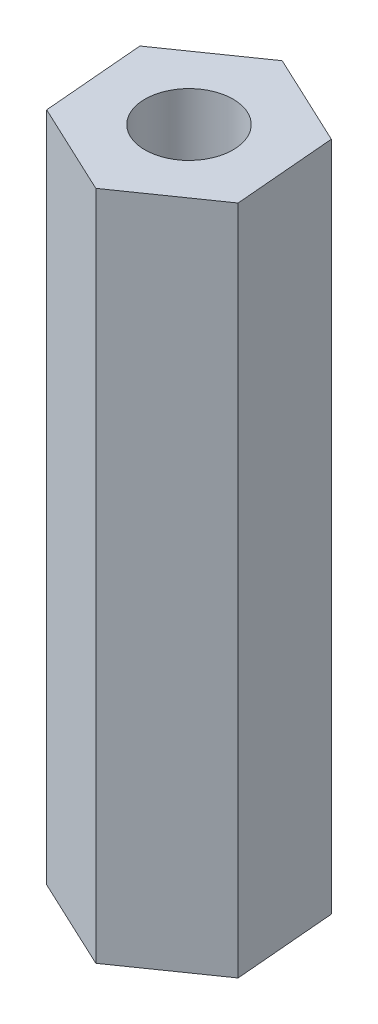
ISO-10303-21;
HEADER;
FILE_DESCRIPTION(('STEP AP214'),'2;1');
FILE_NAME('part.step','',(''),(''),'','','');
FILE_SCHEMA(('AUTOMOTIVE_DESIGN { 1 0 10303 214 1 1 1 1 }'));
ENDSEC;
DATA;
#1=APPLICATION_CONTEXT('core data for automotive mechanical design processes');
#2=APPLICATION_PROTOCOL_DEFINITION('international standard','automotive_design',2000,#1);
#3=PRODUCT_CONTEXT('',#1,'mechanical');
#4=PRODUCT('Part','Part','',(#3));
#5=PRODUCT_RELATED_PRODUCT_CATEGORY('part','',(#4));
#6=PRODUCT_DEFINITION_FORMATION('','',#4);
#7=PRODUCT_DEFINITION_CONTEXT('part definition',#1,'design');
#8=PRODUCT_DEFINITION('design','',#6,#7);
#9=PRODUCT_DEFINITION_SHAPE('','',#8);
#10=(LENGTH_UNIT() NAMED_UNIT(*) SI_UNIT(.MILLI.,.METRE.));
#11=(NAMED_UNIT(*) PLANE_ANGLE_UNIT() SI_UNIT($,.RADIAN.));
#12=(NAMED_UNIT(*) SI_UNIT($,.STERADIAN.) SOLID_ANGLE_UNIT());
#13=UNCERTAINTY_MEASURE_WITH_UNIT(LENGTH_MEASURE(1.E-05),#10,'distance_accuracy_value','');
#14=(GEOMETRIC_REPRESENTATION_CONTEXT(3) GLOBAL_UNCERTAINTY_ASSIGNED_CONTEXT((#13)) GLOBAL_UNIT_ASSIGNED_CONTEXT((#10,
#11,#12)) REPRESENTATION_CONTEXT('',''));
#15=CARTESIAN_POINT('',(0.,0.,0.));
#16=DIRECTION('',(0.,0.,1.));
#17=DIRECTION('',(1.,0.,0.));
#18=AXIS2_PLACEMENT_3D('',#15,#16,#17);
#19=CARTESIAN_POINT('',(0.,19.05,0.));
#20=DIRECTION('',(0.,1.,0.));
#21=DIRECTION('',(0.,0.,1.));
#22=AXIS2_PLACEMENT_3D('',#19,#20,#21);
#23=PLANE('',#22);
#24=DIRECTION('',(0.820598846939836,0.,-0.571504621504508));
#25=VECTOR('',#24,1.);
#26=CARTESIAN_POINT('',(0.245587897106497,19.05,2.89121183858392));
#27=LINE('',#26,#25);
#28=CARTESIAN_POINT('',(0.245587897106497,19.05,2.89121183858392));
#29=VERTEX_POINT('',#28);
#30=CARTESIAN_POINT('',(2.62665684848924,19.05,1.23292056153573));
#31=VERTEX_POINT('',#30);
#32=EDGE_CURVE('E130',#29,#31,#27,.T.);
#33=ORIENTED_EDGE('',*,*,#32,.T.);
#34=DIRECTION('',(-0.0846380971331971,0.,-0.996411758518371));
#35=VECTOR('',#34,1.);
#36=CARTESIAN_POINT('',(2.62665684848924,19.05,1.23292056153573));
#37=LINE('',#36,#35);
#38=CARTESIAN_POINT('',(2.38106895138274,19.05,-1.65829127704819));
#39=VERTEX_POINT('',#38);
#40=EDGE_CURVE('E88',#31,#39,#37,.T.);
#41=ORIENTED_EDGE('',*,*,#40,.T.);
#42=DIRECTION('',(-0.905236944073033,0.,-0.424907137013862));
#43=VECTOR('',#42,1.);
#44=CARTESIAN_POINT('',(2.38106895138274,19.05,-1.65829127704819));
#45=LINE('',#44,#43);
#46=CARTESIAN_POINT('',(-0.245587897106499,19.05,-2.89121183858392));
#47=VERTEX_POINT('',#46);
#48=EDGE_CURVE('E101',#39,#47,#45,.T.);
#49=ORIENTED_EDGE('',*,*,#48,.T.);
#50=DIRECTION('',(-0.820598846939836,0.,0.571504621504509));
#51=VECTOR('',#50,1.);
#52=CARTESIAN_POINT('',(-0.245587897106499,19.05,-2.89121183858392));
#53=LINE('',#52,#51);
#54=CARTESIAN_POINT('',(-2.62665684848924,19.05,-1.23292056153574));
#55=VERTEX_POINT('',#54);
#56=EDGE_CURVE('E95',#47,#55,#53,.T.);
#57=ORIENTED_EDGE('',*,*,#56,.T.);
#58=DIRECTION('',(0.0846380971331965,0.,0.996411758518371));
#59=VECTOR('',#58,1.);
#60=CARTESIAN_POINT('',(-2.62665684848924,19.05,-1.23292056153574));
#61=LINE('',#60,#59);
#62=CARTESIAN_POINT('',(-2.38106895138274,19.05,1.65829127704819));
#63=VERTEX_POINT('',#62);
#64=EDGE_CURVE('E99',#55,#63,#61,.T.);
#65=ORIENTED_EDGE('',*,*,#64,.T.);
#66=DIRECTION('',(0.905236944073033,0.,0.424907137013862));
#67=VECTOR('',#66,1.);
#68=CARTESIAN_POINT('',(-2.38106895138274,19.05,1.65829127704819));
#69=LINE('',#68,#67);
#70=EDGE_CURVE('E51',#63,#29,#69,.T.);
#71=ORIENTED_EDGE('',*,*,#70,.T.);
#72=EDGE_LOOP('',(#33,#41,#49,#57,#65,#71));
#73=FACE_BOUND('',#72,.T.);
#74=CARTESIAN_POINT('',(0.,19.05,0.));
#75=DIRECTION('',(0.,1.,0.));
#76=DIRECTION('',(0.,0.,1.));
#77=AXIS2_PLACEMENT_3D('',#74,#75,#76);
#78=CIRCLE('',#77,1.25);
#79=CARTESIAN_POINT('',(0.,19.05,-1.25));
#80=VERTEX_POINT('',#79);
#81=EDGE_CURVE('E123',#80,#80,#78,.T.);
#82=ORIENTED_EDGE('',*,*,#81,.F.);
#83=EDGE_LOOP('',(#82));
#84=FACE_BOUND('',#83,.T.);
#85=ADVANCED_FACE('F34',(#73,#84),#23,.T.);
#86=CARTESIAN_POINT('',(0.,0.,0.));
#87=DIRECTION('',(0.,1.,0.));
#88=DIRECTION('',(0.,0.,1.));
#89=AXIS2_PLACEMENT_3D('',#86,#87,#88);
#90=PLANE('',#89);
#91=DIRECTION('',(0.820598846939836,0.,-0.571504621504508));
#92=VECTOR('',#91,1.);
#93=CARTESIAN_POINT('',(0.245587897106497,0.,2.89121183858392));
#94=LINE('',#93,#92);
#95=CARTESIAN_POINT('',(0.245587897106497,0.,2.89121183858392));
#96=VERTEX_POINT('',#95);
#97=CARTESIAN_POINT('',(2.62665684848924,0.,1.23292056153573));
#98=VERTEX_POINT('',#97);
#99=EDGE_CURVE('E119',#96,#98,#94,.T.);
#100=ORIENTED_EDGE('',*,*,#99,.F.);
#101=DIRECTION('',(0.905236944073033,0.,0.424907137013862));
#102=VECTOR('',#101,1.);
#103=CARTESIAN_POINT('',(-2.38106895138274,0.,1.65829127704819));
#104=LINE('',#103,#102);
#105=CARTESIAN_POINT('',(-2.38106895138274,0.,1.65829127704819));
#106=VERTEX_POINT('',#105);
#107=EDGE_CURVE('E80',#106,#96,#104,.T.);
#108=ORIENTED_EDGE('',*,*,#107,.F.);
#109=DIRECTION('',(0.0846380971331965,0.,0.996411758518371));
#110=VECTOR('',#109,1.);
#111=CARTESIAN_POINT('',(-2.62665684848924,0.,-1.23292056153574));
#112=LINE('',#111,#110);
#113=CARTESIAN_POINT('',(-2.62665684848924,0.,-1.23292056153574));
#114=VERTEX_POINT('',#113);
#115=EDGE_CURVE('E74',#114,#106,#112,.T.);
#116=ORIENTED_EDGE('',*,*,#115,.F.);
#117=DIRECTION('',(-0.820598846939836,0.,0.571504621504509));
#118=VECTOR('',#117,1.);
#119=CARTESIAN_POINT('',(-0.245587897106499,0.,-2.89121183858392));
#120=LINE('',#119,#118);
#121=CARTESIAN_POINT('',(-0.245587897106499,0.,-2.89121183858392));
#122=VERTEX_POINT('',#121);
#123=EDGE_CURVE('E109',#122,#114,#120,.T.);
#124=ORIENTED_EDGE('',*,*,#123,.F.);
#125=DIRECTION('',(-0.905236944073033,0.,-0.424907137013862));
#126=VECTOR('',#125,1.);
#127=CARTESIAN_POINT('',(2.38106895138274,0.,-1.65829127704819));
#128=LINE('',#127,#126);
#129=CARTESIAN_POINT('',(2.38106895138274,0.,-1.65829127704819));
#130=VERTEX_POINT('',#129);
#131=EDGE_CURVE('E125',#130,#122,#128,.T.);
#132=ORIENTED_EDGE('',*,*,#131,.F.);
#133=DIRECTION('',(-0.0846380971331971,0.,-0.996411758518371));
#134=VECTOR('',#133,1.);
#135=CARTESIAN_POINT('',(2.62665684848924,0.,1.23292056153573));
#136=LINE('',#135,#134);
#137=EDGE_CURVE('E122',#98,#130,#136,.T.);
#138=ORIENTED_EDGE('',*,*,#137,.F.);
#139=EDGE_LOOP('',(#100,#108,#116,#124,#132,#138));
#140=FACE_BOUND('',#139,.T.);
#141=CARTESIAN_POINT('',(0.,0.,0.));
#142=DIRECTION('',(0.,1.,0.));
#143=DIRECTION('',(0.,0.,1.));
#144=AXIS2_PLACEMENT_3D('',#141,#142,#143);
#145=CIRCLE('',#144,1.25);
#146=CARTESIAN_POINT('',(0.,0.,-1.25));
#147=VERTEX_POINT('',#146);
#148=EDGE_CURVE('E223',#147,#147,#145,.T.);
#149=ORIENTED_EDGE('',*,*,#148,.T.);
#150=EDGE_LOOP('',(#149));
#151=FACE_BOUND('',#150,.T.);
#152=ADVANCED_FACE('F139',(#140,#151),#90,.F.);
#153=CARTESIAN_POINT('',(0.245587897106497,19.05,2.89121183858392));
#154=DIRECTION('',(-0.571504621504509,0.,-0.820598846939836));
#155=DIRECTION('',(-0.820598846939836,0.,0.571504621504509));
#156=AXIS2_PLACEMENT_3D('',#153,#154,#155);
#157=PLANE('',#156);
#158=ORIENTED_EDGE('',*,*,#99,.T.);
#159=DIRECTION('',(0.,-1.,0.));
#160=VECTOR('',#159,1.);
#161=CARTESIAN_POINT('',(2.62665684848924,19.05,1.23292056153573));
#162=LINE('',#161,#160);
#163=EDGE_CURVE('E11',#31,#98,#162,.T.);
#164=ORIENTED_EDGE('',*,*,#163,.F.);
#165=ORIENTED_EDGE('',*,*,#32,.F.);
#166=DIRECTION('',(0.,-1.,0.));
#167=VECTOR('',#166,1.);
#168=CARTESIAN_POINT('',(0.245587897106497,19.05,2.89121183858392));
#169=LINE('',#168,#167);
#170=EDGE_CURVE('E115',#29,#96,#169,.T.);
#171=ORIENTED_EDGE('',*,*,#170,.T.);
#172=EDGE_LOOP('',(#158,#164,#165,#171));
#173=FACE_BOUND('',#172,.T.);
#174=ADVANCED_FACE('F36',(#173),#157,.F.);
#175=CARTESIAN_POINT('',(2.62665684848924,19.05,1.23292056153573));
#176=DIRECTION('',(-0.99641175851837,0.,0.0846380971331971));
#177=DIRECTION('',(0.0846380971331971,0.,0.99641175851837));
#178=AXIS2_PLACEMENT_3D('',#175,#176,#177);
#179=PLANE('',#178);
#180=ORIENTED_EDGE('',*,*,#137,.T.);
#181=DIRECTION('',(0.,-1.,0.));
#182=VECTOR('',#181,1.);
#183=CARTESIAN_POINT('',(2.38106895138274,19.05,-1.65829127704819));
#184=LINE('',#183,#182);
#185=EDGE_CURVE('E43',#39,#130,#184,.T.);
#186=ORIENTED_EDGE('',*,*,#185,.F.);
#187=ORIENTED_EDGE('',*,*,#40,.F.);
#188=ORIENTED_EDGE('',*,*,#163,.T.);
#189=EDGE_LOOP('',(#180,#186,#187,#188));
#190=FACE_BOUND('',#189,.T.);
#191=ADVANCED_FACE('F164',(#190),#179,.F.);
#192=CARTESIAN_POINT('',(2.38106895138274,19.05,-1.65829127704819));
#193=DIRECTION('',(-0.424907137013862,0.,0.905236944073033));
#194=DIRECTION('',(0.905236944073033,0.,0.424907137013862));
#195=AXIS2_PLACEMENT_3D('',#192,#193,#194);
#196=PLANE('',#195);
#197=ORIENTED_EDGE('',*,*,#131,.T.);
#198=DIRECTION('',(0.,-1.,0.));
#199=VECTOR('',#198,1.);
#200=CARTESIAN_POINT('',(-0.245587897106499,19.05,-2.89121183858392));
#201=LINE('',#200,#199);
#202=EDGE_CURVE('E110',#47,#122,#201,.T.);
#203=ORIENTED_EDGE('',*,*,#202,.F.);
#204=ORIENTED_EDGE('',*,*,#48,.F.);
#205=ORIENTED_EDGE('',*,*,#185,.T.);
#206=EDGE_LOOP('',(#197,#203,#204,#205));
#207=FACE_BOUND('',#206,.T.);
#208=ADVANCED_FACE('F136',(#207),#196,.F.);
#209=CARTESIAN_POINT('',(-0.245587897106499,19.05,-2.89121183858392));
#210=DIRECTION('',(0.571504621504509,0.,0.820598846939836));
#211=DIRECTION('',(0.820598846939836,0.,-0.571504621504509));
#212=AXIS2_PLACEMENT_3D('',#209,#210,#211);
#213=PLANE('',#212);
#214=ORIENTED_EDGE('',*,*,#123,.T.);
#215=DIRECTION('',(0.,-1.,0.));
#216=VECTOR('',#215,1.);
#217=CARTESIAN_POINT('',(-2.62665684848924,19.05,-1.23292056153574));
#218=LINE('',#217,#216);
#219=EDGE_CURVE('E106',#55,#114,#218,.T.);
#220=ORIENTED_EDGE('',*,*,#219,.F.);
#221=ORIENTED_EDGE('',*,*,#56,.F.);
#222=ORIENTED_EDGE('',*,*,#202,.T.);
#223=EDGE_LOOP('',(#214,#220,#221,#222));
#224=FACE_BOUND('',#223,.T.);
#225=ADVANCED_FACE('F107',(#224),#213,.F.);
#226=CARTESIAN_POINT('',(-2.62665684848924,19.05,-1.23292056153574));
#227=DIRECTION('',(0.99641175851837,0.,-0.0846380971331965));
#228=DIRECTION('',(-0.0846380971331965,0.,-0.996411758518371));
#229=AXIS2_PLACEMENT_3D('',#226,#227,#228);
#230=PLANE('',#229);
#231=ORIENTED_EDGE('',*,*,#115,.T.);
#232=DIRECTION('',(0.,-1.,0.));
#233=VECTOR('',#232,1.);
#234=CARTESIAN_POINT('',(-2.38106895138274,19.05,1.65829127704819));
#235=LINE('',#234,#233);
#236=EDGE_CURVE('E111',#63,#106,#235,.T.);
#237=ORIENTED_EDGE('',*,*,#236,.F.);
#238=ORIENTED_EDGE('',*,*,#64,.F.);
#239=ORIENTED_EDGE('',*,*,#219,.T.);
#240=EDGE_LOOP('',(#231,#237,#238,#239));
#241=FACE_BOUND('',#240,.T.);
#242=ADVANCED_FACE('F113',(#241),#230,.F.);
#243=CARTESIAN_POINT('',(-2.38106895138274,19.05,1.65829127704819));
#244=DIRECTION('',(0.424907137013862,0.,-0.905236944073033));
#245=DIRECTION('',(-0.905236944073033,0.,-0.424907137013862));
#246=AXIS2_PLACEMENT_3D('',#243,#244,#245);
#247=PLANE('',#246);
#248=ORIENTED_EDGE('',*,*,#107,.T.);
#249=ORIENTED_EDGE('',*,*,#170,.F.);
#250=ORIENTED_EDGE('',*,*,#70,.F.);
#251=ORIENTED_EDGE('',*,*,#236,.T.);
#252=EDGE_LOOP('',(#248,#249,#250,#251));
#253=FACE_BOUND('',#252,.T.);
#254=ADVANCED_FACE('F144',(#253),#247,.F.);
#255=CARTESIAN_POINT('',(0.,19.05,0.));
#256=DIRECTION('',(0.,-1.,0.));
#257=DIRECTION('',(0.,0.,-1.));
#258=AXIS2_PLACEMENT_3D('',#255,#256,#257);
#259=CYLINDRICAL_SURFACE('',#258,1.25);
#260=CARTESIAN_POINT('',(0.,19.05,-1.25));
#261=CARTESIAN_POINT('',(0.,18.8515625,-1.25));
#262=CARTESIAN_POINT('',(0.,18.653125,-1.25));
#263=CARTESIAN_POINT('',(0.,18.25625,-1.25));
#264=CARTESIAN_POINT('',(0.,18.0578125,-1.25));
#265=CARTESIAN_POINT('',(0.,17.6609375,-1.25));
#266=CARTESIAN_POINT('',(0.,17.4625,-1.25));
#267=CARTESIAN_POINT('',(0.,17.065625,-1.25));
#268=CARTESIAN_POINT('',(0.,16.8671875,-1.25));
#269=CARTESIAN_POINT('',(0.,16.4703125,-1.25));
#270=CARTESIAN_POINT('',(0.,16.271875,-1.25));
#271=CARTESIAN_POINT('',(0.,15.875,-1.25));
#272=CARTESIAN_POINT('',(0.,15.6765625,-1.25));
#273=CARTESIAN_POINT('',(0.,15.2796875,-1.25));
#274=CARTESIAN_POINT('',(0.,15.08125,-1.25));
#275=CARTESIAN_POINT('',(0.,14.684375,-1.25));
#276=CARTESIAN_POINT('',(0.,14.4859375,-1.25));
#277=CARTESIAN_POINT('',(0.,14.0890625,-1.25));
#278=CARTESIAN_POINT('',(0.,13.890625,-1.25));
#279=CARTESIAN_POINT('',(0.,13.49375,-1.25));
#280=CARTESIAN_POINT('',(0.,13.2953125,-1.25));
#281=CARTESIAN_POINT('',(0.,12.8984375,-1.25));
#282=CARTESIAN_POINT('',(0.,12.7,-1.25));
#283=CARTESIAN_POINT('',(0.,12.303125,-1.25));
#284=CARTESIAN_POINT('',(0.,12.1046875,-1.25));
#285=CARTESIAN_POINT('',(0.,11.7078125,-1.25));
#286=CARTESIAN_POINT('',(0.,11.509375,-1.25));
#287=CARTESIAN_POINT('',(0.,11.1125,-1.25));
#288=CARTESIAN_POINT('',(0.,10.9140625,-1.25));
#289=CARTESIAN_POINT('',(0.,10.5171875,-1.25));
#290=CARTESIAN_POINT('',(0.,10.31875,-1.25));
#291=CARTESIAN_POINT('',(0.,9.921875,-1.25));
#292=CARTESIAN_POINT('',(0.,9.7234375,-1.25));
#293=CARTESIAN_POINT('',(0.,9.3265625,-1.25));
#294=CARTESIAN_POINT('',(0.,9.128125,-1.25));
#295=CARTESIAN_POINT('',(0.,8.73125,-1.25));
#296=CARTESIAN_POINT('',(0.,8.5328125,-1.25));
#297=CARTESIAN_POINT('',(0.,8.1359375,-1.25));
#298=CARTESIAN_POINT('',(0.,7.9375,-1.25));
#299=CARTESIAN_POINT('',(0.,7.540625,-1.25));
#300=CARTESIAN_POINT('',(0.,7.3421875,-1.25));
#301=CARTESIAN_POINT('',(0.,6.9453125,-1.25));
#302=CARTESIAN_POINT('',(0.,6.746875,-1.25));
#303=CARTESIAN_POINT('',(0.,6.35,-1.25));
#304=CARTESIAN_POINT('',(0.,6.1515625,-1.25));
#305=CARTESIAN_POINT('',(0.,5.7546875,-1.25));
#306=CARTESIAN_POINT('',(0.,5.55625,-1.25));
#307=CARTESIAN_POINT('',(0.,5.159375,-1.25));
#308=CARTESIAN_POINT('',(0.,4.9609375,-1.25));
#309=CARTESIAN_POINT('',(0.,4.5640625,-1.25));
#310=CARTESIAN_POINT('',(0.,4.365625,-1.25));
#311=CARTESIAN_POINT('',(0.,3.96875,-1.25));
#312=CARTESIAN_POINT('',(0.,3.7703125,-1.25));
#313=CARTESIAN_POINT('',(0.,3.3734375,-1.25));
#314=CARTESIAN_POINT('',(0.,3.175,-1.25));
#315=CARTESIAN_POINT('',(0.,2.778125,-1.25));
#316=CARTESIAN_POINT('',(0.,2.5796875,-1.25));
#317=CARTESIAN_POINT('',(0.,2.1828125,-1.25));
#318=CARTESIAN_POINT('',(0.,1.984375,-1.25));
#319=CARTESIAN_POINT('',(0.,1.5875,-1.25));
#320=CARTESIAN_POINT('',(0.,1.3890625,-1.25));
#321=CARTESIAN_POINT('',(0.,0.992187500000001,-1.25));
#322=CARTESIAN_POINT('',(0.,0.793750000000001,-1.25));
#323=CARTESIAN_POINT('',(0.,0.396875,-1.25));
#324=CARTESIAN_POINT('',(0.,0.1984375,-1.25));
#325=CARTESIAN_POINT('',(0.,0.,-1.25));
#326=B_SPLINE_CURVE_WITH_KNOTS('',3,(#260,#261,#262,#263,#264,#265,#266,#267,#268,#269,#270,
#271,#272,#273,#274,#275,#276,#277,#278,#279,#280,#281,#282,#283,#284,#285,#286,#287,#288,#289,
#290,#291,#292,#293,#294,#295,#296,#297,#298,#299,#300,#301,#302,#303,#304,#305,#306,#307,#308,
#309,#310,#311,#312,#313,#314,#315,#316,#317,#318,#319,#320,#321,#322,#323,#324,#325),
.UNSPECIFIED.,.F.,.F.,(4,2,2,2,2,2,2,2,2,2,2,2,2,2,2,2,2,2,2,2,2,2,2,2,2,2,2,2,2,2,2,2,4),(0.,
0.5953125,1.190625,1.7859375,2.38125,2.9765625,3.571875,4.1671875,4.7625,5.3578125,5.953125,
6.5484375,7.14375,7.7390625,8.334375,8.9296875,9.525,10.1203125,10.715625,11.3109375,11.90625,
12.5015625,13.096875,13.6921875,14.2875,14.8828125,15.478125,16.0734375,16.66875,17.2640625,
17.859375,18.4546875,19.05),.UNSPECIFIED.);
#327=EDGE_CURVE('BSEAM146',#80,#147,#326,.T.);
#328=ORIENTED_EDGE('',*,*,#81,.T.);
#329=ORIENTED_EDGE('',*,*,#148,.F.);
#330=ORIENTED_EDGE('',*,*,#327,.T.);
#331=ORIENTED_EDGE('',*,*,#327,.F.);
#332=EDGE_LOOP('',(#328,#330,#329,#331));
#333=FACE_BOUND('',#332,.T.);
#334=ADVANCED_FACE('F146',(#333),#259,.F.);
#335=CLOSED_SHELL('',(#85,#152,#174,#191,#208,#225,#242,#254,#334));
#336=MANIFOLD_SOLID_BREP('B2',#335);
#337=ADVANCED_BREP_SHAPE_REPRESENTATION('',(#18,#336),#14);
#338=SHAPE_DEFINITION_REPRESENTATION(#9,#337);
ENDSEC;
END-ISO-10303-21;
